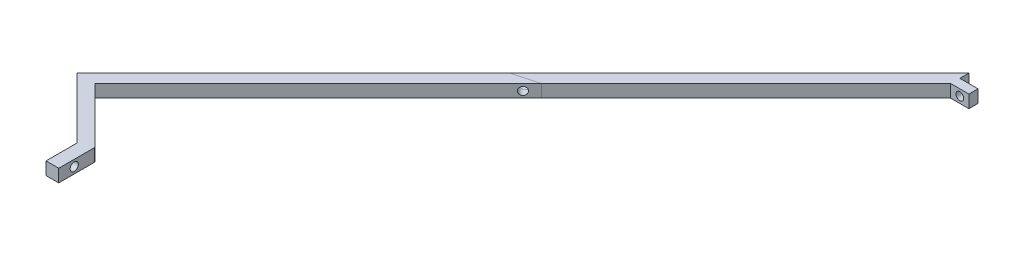
ISO-10303-21;
HEADER;
FILE_DESCRIPTION(('STEP AP214'),'2;1');
FILE_NAME('part.step','',(''),(''),'','','');
FILE_SCHEMA(('AUTOMOTIVE_DESIGN { 1 0 10303 214 1 1 1 1 }'));
ENDSEC;
DATA;
#1=APPLICATION_CONTEXT('core data for automotive mechanical design processes');
#2=APPLICATION_PROTOCOL_DEFINITION('international standard','automotive_design',2000,#1);
#3=PRODUCT_CONTEXT('',#1,'mechanical');
#4=PRODUCT('Part','Part','',(#3));
#5=PRODUCT_RELATED_PRODUCT_CATEGORY('part','',(#4));
#6=PRODUCT_DEFINITION_FORMATION('','',#4);
#7=PRODUCT_DEFINITION_CONTEXT('part definition',#1,'design');
#8=PRODUCT_DEFINITION('design','',#6,#7);
#9=PRODUCT_DEFINITION_SHAPE('','',#8);
#10=(LENGTH_UNIT() NAMED_UNIT(*) SI_UNIT(.MILLI.,.METRE.));
#11=(NAMED_UNIT(*) PLANE_ANGLE_UNIT() SI_UNIT($,.RADIAN.));
#12=(NAMED_UNIT(*) SI_UNIT($,.STERADIAN.) SOLID_ANGLE_UNIT());
#13=UNCERTAINTY_MEASURE_WITH_UNIT(LENGTH_MEASURE(1.E-05),#10,'distance_accuracy_value','');
#14=(GEOMETRIC_REPRESENTATION_CONTEXT(3) GLOBAL_UNCERTAINTY_ASSIGNED_CONTEXT((#13)) GLOBAL_UNIT_ASSIGNED_CONTEXT((#10,
#11,#12)) REPRESENTATION_CONTEXT('',''));
#15=CARTESIAN_POINT('',(0.,0.,0.));
#16=DIRECTION('',(0.,0.,1.));
#17=DIRECTION('',(1.,0.,0.));
#18=AXIS2_PLACEMENT_3D('',#15,#16,#17);
#19=CARTESIAN_POINT('',(-147.271192020746,-0.00999999999999959,110.472946406711));
#20=DIRECTION('',(0.258819045102527,0.,0.965925826289067));
#21=DIRECTION('',(0.965925826289067,0.,-0.258819045102527));
#22=AXIS2_PLACEMENT_3D('',#19,#20,#21);
#23=PLANE('',#22);
#24=CARTESIAN_POINT('',(-141.694416662494,3.5,108.978653953098));
#25=DIRECTION('',(0.258819045102527,0.,0.965925826289067));
#26=DIRECTION('',(-0.965925826289067,0.,0.258819045102527));
#27=AXIS2_PLACEMENT_3D('',#24,#25,#26);
#28=ELLIPSE('',#27,2.4826061575154,2.15000000000001);
#29=CARTESIAN_POINT('',(-144.092430066542,3.5,109.621199708151));
#30=VERTEX_POINT('',#29);
#31=EDGE_CURVE('E192',#30,#30,#28,.F.);
#32=ORIENTED_EDGE('',*,*,#31,.F.);
#33=EDGE_LOOP('',(#32));
#34=FACE_BOUND('',#33,.T.);
#35=DIRECTION('',(0.,-1.,0.));
#36=VECTOR('',#35,1.);
#37=CARTESIAN_POINT('',(-147.271192020746,7.,110.472946406711));
#38=LINE('',#37,#36);
#39=CARTESIAN_POINT('',(-147.271192020746,7.,110.472946406711));
#40=VERTEX_POINT('',#39);
#41=CARTESIAN_POINT('',(-147.271192020746,0.,110.472946406711));
#42=VERTEX_POINT('',#41);
#43=EDGE_CURVE('E260',#40,#42,#38,.T.);
#44=ORIENTED_EDGE('',*,*,#43,.F.);
#45=DIRECTION('',(0.965925826289067,0.,-0.258819045102527));
#46=VECTOR('',#45,1.);
#47=CARTESIAN_POINT('',(17.752937359096,7.,66.2548642077321));
#48=LINE('',#47,#46);
#49=CARTESIAN_POINT('',(-133.610937982901,7.,106.812692368866));
#50=VERTEX_POINT('',#49);
#51=EDGE_CURVE('E105',#40,#50,#48,.T.);
#52=ORIENTED_EDGE('',*,*,#51,.T.);
#53=DIRECTION('',(0.,-1.,0.));
#54=VECTOR('',#53,1.);
#55=CARTESIAN_POINT('',(-133.610937982901,7.,106.812692368866));
#56=LINE('',#55,#54);
#57=CARTESIAN_POINT('',(-133.610937982901,0.,106.812692368866));
#58=VERTEX_POINT('',#57);
#59=EDGE_CURVE('E13',#50,#58,#56,.T.);
#60=ORIENTED_EDGE('',*,*,#59,.T.);
#61=DIRECTION('',(0.965925826289067,0.,-0.258819045102527));
#62=VECTOR('',#61,1.);
#63=CARTESIAN_POINT('',(17.752937359096,0.,66.2548642077321));
#64=LINE('',#63,#62);
#65=EDGE_CURVE('E100',#42,#58,#64,.T.);
#66=ORIENTED_EDGE('',*,*,#65,.F.);
#67=EDGE_LOOP('',(#44,#52,#60,#66));
#68=FACE_BOUND('',#67,.T.);
#69=ADVANCED_FACE('F97',(#34,#68),#23,.F.);
#70=CARTESIAN_POINT('',(-226.113598123046,3.5,271.475778095972));
#71=DIRECTION('',(-1.,0.,0.));
#72=DIRECTION('',(0.,0.,1.));
#73=AXIS2_PLACEMENT_3D('',#70,#71,#72);
#74=CYLINDRICAL_SURFACE('',#73,2.24999999999995);
#75=CARTESIAN_POINT('',(-226.113598123046,3.5,271.475778095972));
#76=DIRECTION('',(-1.,0.,0.));
#77=DIRECTION('',(0.,0.,1.));
#78=AXIS2_PLACEMENT_3D('',#75,#76,#77);
#79=CIRCLE('',#78,2.24999999999995);
#80=CARTESIAN_POINT('',(-226.113598123046,3.5,273.725778095972));
#81=VERTEX_POINT('',#80);
#82=EDGE_CURVE('E220',#81,#81,#79,.T.);
#83=ORIENTED_EDGE('',*,*,#82,.F.);
#84=EDGE_LOOP('',(#83));
#85=FACE_BOUND('',#84,.T.);
#86=CARTESIAN_POINT('',(-233.113598123046,3.5,271.475778095972));
#87=DIRECTION('',(-1.,0.,0.));
#88=DIRECTION('',(0.,0.,1.));
#89=AXIS2_PLACEMENT_3D('',#86,#87,#88);
#90=CIRCLE('',#89,2.24999999999995);
#91=CARTESIAN_POINT('',(-233.113598123046,3.5,273.725778095972));
#92=VERTEX_POINT('',#91);
#93=EDGE_CURVE('E257',#92,#92,#90,.T.);
#94=ORIENTED_EDGE('',*,*,#93,.T.);
#95=EDGE_LOOP('',(#94));
#96=FACE_BOUND('',#95,.T.);
#97=ADVANCED_FACE('F303',(#85,#96),#74,.F.);
#98=CARTESIAN_POINT('',(16.9562162523099,7.,16.9562162523099));
#99=DIRECTION('',(0.707106781186547,0.,0.707106781186547));
#100=DIRECTION('',(0.707106781186548,0.,-0.707106781186548));
#101=AXIS2_PLACEMENT_3D('',#98,#99,#100);
#102=PLANE('',#101);
#103=DIRECTION('',(-0.707106781186548,0.,0.707106781186548));
#104=VECTOR('',#103,1.);
#105=CARTESIAN_POINT('',(16.9562162523099,0.,16.9562162523099));
#106=LINE('',#105,#104);
#107=CARTESIAN_POINT('',(-226.113598123046,0.,260.026030627666));
#108=VERTEX_POINT('',#107);
#109=CARTESIAN_POINT('',(-226.435177530265,0.,260.347610034884));
#110=VERTEX_POINT('',#109);
#111=EDGE_CURVE('E234',#108,#110,#106,.T.);
#112=ORIENTED_EDGE('',*,*,#111,.F.);
#113=DIRECTION('',(0.,-1.,0.));
#114=VECTOR('',#113,1.);
#115=CARTESIAN_POINT('',(-226.113598123046,7.,260.026030627666));
#116=LINE('',#115,#114);
#117=CARTESIAN_POINT('',(-226.113598123046,7.,260.026030627666));
#118=VERTEX_POINT('',#117);
#119=EDGE_CURVE('E243',#118,#108,#116,.T.);
#120=ORIENTED_EDGE('',*,*,#119,.F.);
#121=DIRECTION('',(-0.707106781186548,0.,0.707106781186548));
#122=VECTOR('',#121,1.);
#123=CARTESIAN_POINT('',(16.9562162523099,7.,16.9562162523099));
#124=LINE('',#123,#122);
#125=CARTESIAN_POINT('',(-226.435177530265,7.,260.347610034884));
#126=VERTEX_POINT('',#125);
#127=EDGE_CURVE('E209',#118,#126,#124,.T.);
#128=ORIENTED_EDGE('',*,*,#127,.T.);
#129=DIRECTION('',(0.,-1.,0.));
#130=VECTOR('',#129,1.);
#131=CARTESIAN_POINT('',(-226.435177530265,7.,260.347610034884));
#132=LINE('',#131,#130);
#133=EDGE_CURVE('E245',#126,#110,#132,.T.);
#134=ORIENTED_EDGE('',*,*,#133,.T.);
#135=EDGE_LOOP('',(#112,#120,#128,#134));
#136=FACE_BOUND('',#135,.T.);
#137=ADVANCED_FACE('F283',(#136),#102,.T.);
#138=CARTESIAN_POINT('',(0.,7.,260.347610034884));
#139=DIRECTION('',(0.,0.,1.));
#140=DIRECTION('',(1.,0.,0.));
#141=AXIS2_PLACEMENT_3D('',#138,#139,#140);
#142=PLANE('',#141);
#143=DIRECTION('',(-1.,0.,0.));
#144=VECTOR('',#143,1.);
#145=CARTESIAN_POINT('',(0.,0.,260.347610034884));
#146=LINE('',#145,#144);
#147=CARTESIAN_POINT('',(-226.113598123046,0.,260.347610034884));
#148=VERTEX_POINT('',#147);
#149=EDGE_CURVE('E231',#148,#110,#146,.T.);
#150=ORIENTED_EDGE('',*,*,#149,.T.);
#151=ORIENTED_EDGE('',*,*,#133,.F.);
#152=DIRECTION('',(-1.,0.,0.));
#153=VECTOR('',#152,1.);
#154=CARTESIAN_POINT('',(0.,7.,260.347610034884));
#155=LINE('',#154,#153);
#156=CARTESIAN_POINT('',(-226.113598123046,7.,260.347610034884));
#157=VERTEX_POINT('',#156);
#158=EDGE_CURVE('E207',#157,#126,#155,.T.);
#159=ORIENTED_EDGE('',*,*,#158,.F.);
#160=DIRECTION('',(0.,-1.,0.));
#161=VECTOR('',#160,1.);
#162=CARTESIAN_POINT('',(-226.113598123046,7.,260.347610034884));
#163=LINE('',#162,#161);
#164=EDGE_CURVE('E247',#157,#148,#163,.T.);
#165=ORIENTED_EDGE('',*,*,#164,.T.);
#166=EDGE_LOOP('',(#150,#151,#159,#165));
#167=FACE_BOUND('',#166,.T.);
#168=ADVANCED_FACE('F279',(#167),#142,.F.);
#169=CARTESIAN_POINT('',(-226.113598123046,7.,0.));
#170=DIRECTION('',(1.,0.,0.));
#171=DIRECTION('',(0.,0.,-1.));
#172=AXIS2_PLACEMENT_3D('',#169,#170,#171);
#173=PLANE('',#172);
#174=ORIENTED_EDGE('',*,*,#82,.T.);
#175=EDGE_LOOP('',(#174));
#176=FACE_BOUND('',#175,.T.);
#177=DIRECTION('',(0.,0.,1.));
#178=VECTOR('',#177,1.);
#179=CARTESIAN_POINT('',(-226.113598123046,0.,0.));
#180=LINE('',#179,#178);
#181=CARTESIAN_POINT('',(-226.113598123046,0.,280.026030627666));
#182=VERTEX_POINT('',#181);
#183=EDGE_CURVE('E228',#148,#182,#180,.T.);
#184=ORIENTED_EDGE('',*,*,#183,.F.);
#185=ORIENTED_EDGE('',*,*,#164,.F.);
#186=DIRECTION('',(0.,0.,1.));
#187=VECTOR('',#186,1.);
#188=CARTESIAN_POINT('',(-226.113598123046,7.,0.));
#189=LINE('',#188,#187);
#190=CARTESIAN_POINT('',(-226.113598123046,7.,280.026030627666));
#191=VERTEX_POINT('',#190);
#192=EDGE_CURVE('E204',#157,#191,#189,.T.);
#193=ORIENTED_EDGE('',*,*,#192,.T.);
#194=DIRECTION('',(0.,-1.,0.));
#195=VECTOR('',#194,1.);
#196=CARTESIAN_POINT('',(-226.113598123046,7.,280.026030627666));
#197=LINE('',#196,#195);
#198=EDGE_CURVE('E249',#191,#182,#197,.T.);
#199=ORIENTED_EDGE('',*,*,#198,.T.);
#200=EDGE_LOOP('',(#184,#185,#193,#199));
#201=FACE_BOUND('',#200,.T.);
#202=ADVANCED_FACE('F273',(#176,#201),#173,.T.);
#203=CARTESIAN_POINT('',(0.,7.,280.026030627666));
#204=DIRECTION('',(0.,0.,1.));
#205=DIRECTION('',(1.,0.,0.));
#206=AXIS2_PLACEMENT_3D('',#203,#204,#205);
#207=PLANE('',#206);
#208=DIRECTION('',(-1.,0.,0.));
#209=VECTOR('',#208,1.);
#210=CARTESIAN_POINT('',(0.,0.,280.026030627666));
#211=LINE('',#210,#209);
#212=CARTESIAN_POINT('',(-233.113598123046,0.,280.026030627666));
#213=VERTEX_POINT('',#212);
#214=EDGE_CURVE('E225',#182,#213,#211,.T.);
#215=ORIENTED_EDGE('',*,*,#214,.F.);
#216=ORIENTED_EDGE('',*,*,#198,.F.);
#217=DIRECTION('',(-1.,0.,0.));
#218=VECTOR('',#217,1.);
#219=CARTESIAN_POINT('',(0.,7.,280.026030627666));
#220=LINE('',#219,#218);
#221=CARTESIAN_POINT('',(-233.113598123046,7.,280.026030627666));
#222=VERTEX_POINT('',#221);
#223=EDGE_CURVE('E198',#191,#222,#220,.T.);
#224=ORIENTED_EDGE('',*,*,#223,.T.);
#225=DIRECTION('',(0.,-1.,0.));
#226=VECTOR('',#225,1.);
#227=CARTESIAN_POINT('',(-233.113598123046,7.,280.026030627666));
#228=LINE('',#227,#226);
#229=EDGE_CURVE('E251',#222,#213,#228,.T.);
#230=ORIENTED_EDGE('',*,*,#229,.T.);
#231=EDGE_LOOP('',(#215,#216,#224,#230));
#232=FACE_BOUND('',#231,.T.);
#233=ADVANCED_FACE('F270',(#232),#207,.T.);
#234=CARTESIAN_POINT('',(-233.113598123046,7.,0.));
#235=DIRECTION('',(-1.,0.,0.));
#236=DIRECTION('',(0.,0.,1.));
#237=AXIS2_PLACEMENT_3D('',#234,#235,#236);
#238=PLANE('',#237);
#239=ORIENTED_EDGE('',*,*,#93,.F.);
#240=EDGE_LOOP('',(#239));
#241=FACE_BOUND('',#240,.T.);
#242=DIRECTION('',(0.,0.,-1.));
#243=VECTOR('',#242,1.);
#244=CARTESIAN_POINT('',(-233.113598123046,0.,0.));
#245=LINE('',#244,#243);
#246=CARTESIAN_POINT('',(-233.113598123046,0.,262.925525564278));
#247=VERTEX_POINT('',#246);
#248=EDGE_CURVE('E222',#213,#247,#245,.T.);
#249=ORIENTED_EDGE('',*,*,#248,.F.);
#250=ORIENTED_EDGE('',*,*,#229,.F.);
#251=DIRECTION('',(0.,0.,-1.));
#252=VECTOR('',#251,1.);
#253=CARTESIAN_POINT('',(-233.113598123046,7.,0.));
#254=LINE('',#253,#252);
#255=CARTESIAN_POINT('',(-233.113598123046,7.,262.925525564278));
#256=VERTEX_POINT('',#255);
#257=EDGE_CURVE('E196',#222,#256,#254,.T.);
#258=ORIENTED_EDGE('',*,*,#257,.T.);
#259=DIRECTION('',(0.,-1.,0.));
#260=VECTOR('',#259,1.);
#261=CARTESIAN_POINT('',(-233.113598123046,7.,262.925525564278));
#262=LINE('',#261,#260);
#263=EDGE_CURVE('E193',#256,#247,#262,.T.);
#264=ORIENTED_EDGE('',*,*,#263,.T.);
#265=EDGE_LOOP('',(#249,#250,#258,#264));
#266=FACE_BOUND('',#265,.T.);
#267=ADVANCED_FACE('F266',(#241,#266),#238,.T.);
#268=CARTESIAN_POINT('',(-248.019561843662,7.,248.019561843662));
#269=DIRECTION('',(-0.707106781186547,0.,0.707106781186548));
#270=DIRECTION('',(0.707106781186548,0.,0.707106781186547));
#271=AXIS2_PLACEMENT_3D('',#268,#269,#270);
#272=PLANE('',#271);
#273=DIRECTION('',(-0.707106781186548,0.,-0.707106781186547));
#274=VECTOR('',#273,1.);
#275=CARTESIAN_POINT('',(-248.019561843662,0.,248.019561843662));
#276=LINE('',#275,#274);
#277=CARTESIAN_POINT('',(-266.418684650679,0.,229.620439036644));
#278=VERTEX_POINT('',#277);
#279=EDGE_CURVE('E219',#247,#278,#276,.T.);
#280=ORIENTED_EDGE('',*,*,#279,.F.);
#281=ORIENTED_EDGE('',*,*,#263,.F.);
#282=DIRECTION('',(-0.707106781186548,0.,-0.707106781186547));
#283=VECTOR('',#282,1.);
#284=CARTESIAN_POINT('',(-248.019561843662,7.,248.019561843662));
#285=LINE('',#284,#283);
#286=CARTESIAN_POINT('',(-266.418684650679,7.,229.620439036644));
#287=VERTEX_POINT('',#286);
#288=EDGE_CURVE('E177',#256,#287,#285,.T.);
#289=ORIENTED_EDGE('',*,*,#288,.T.);
#290=DIRECTION('',(0.,-1.,0.));
#291=VECTOR('',#290,1.);
#292=CARTESIAN_POINT('',(-266.418684650679,7.,229.620439036644));
#293=LINE('',#292,#291);
#294=EDGE_CURVE('E186',#287,#278,#293,.T.);
#295=ORIENTED_EDGE('',*,*,#294,.T.);
#296=EDGE_LOOP('',(#280,#281,#289,#295));
#297=FACE_BOUND('',#296,.T.);
#298=ADVANCED_FACE('F195',(#297),#272,.T.);
#299=CARTESIAN_POINT('',(-18.3991228070176,7.,-18.3991228070176));
#300=DIRECTION('',(0.707106781186547,0.,0.707106781186547));
#301=DIRECTION('',(0.707106781186548,0.,-0.707106781186548));
#302=AXIS2_PLACEMENT_3D('',#299,#300,#301);
#303=PLANE('',#302);
#304=DIRECTION('',(-0.707106781186548,0.,0.707106781186548));
#305=VECTOR('',#304,1.);
#306=CARTESIAN_POINT('',(-18.3991228070176,7.,-18.3991228070176));
#307=LINE('',#306,#305);
#308=EDGE_CURVE('E172',#40,#287,#307,.T.);
#309=ORIENTED_EDGE('',*,*,#308,.F.);
#310=ORIENTED_EDGE('',*,*,#43,.T.);
#311=DIRECTION('',(-0.707106781186548,0.,0.707106781186548));
#312=VECTOR('',#311,1.);
#313=CARTESIAN_POINT('',(-18.3991228070176,0.,-18.3991228070176));
#314=LINE('',#313,#312);
#315=EDGE_CURVE('E188',#42,#278,#314,.T.);
#316=ORIENTED_EDGE('',*,*,#315,.T.);
#317=ORIENTED_EDGE('',*,*,#294,.F.);
#318=EDGE_LOOP('',(#309,#310,#316,#317));
#319=FACE_BOUND('',#318,.T.);
#320=ADVANCED_FACE('F187',(#319),#303,.F.);
#321=CARTESIAN_POINT('',(0.,0.,0.));
#322=DIRECTION('',(0.,1.,0.));
#323=DIRECTION('',(0.,0.,1.));
#324=AXIS2_PLACEMENT_3D('',#321,#322,#323);
#325=PLANE('',#324);
#326=ORIENTED_EDGE('',*,*,#315,.F.);
#327=ORIENTED_EDGE('',*,*,#65,.T.);
#328=DIRECTION('',(-0.707106781186546,0.,0.707106781186549));
#329=VECTOR('',#328,1.);
#330=CARTESIAN_POINT('',(-13.3991228070176,0.,-13.3991228070175));
#331=LINE('',#330,#329);
#332=CARTESIAN_POINT('',(-256.468937182373,0.,229.670691568339));
#333=VERTEX_POINT('',#332);
#334=EDGE_CURVE('E183',#58,#333,#331,.T.);
#335=ORIENTED_EDGE('',*,*,#334,.T.);
#336=DIRECTION('',(0.707106781186547,0.,0.707106781186548));
#337=VECTOR('',#336,1.);
#338=CARTESIAN_POINT('',(-243.069814375356,0.,243.069814375356));
#339=LINE('',#338,#337);
#340=EDGE_CURVE('E237',#333,#108,#339,.T.);
#341=ORIENTED_EDGE('',*,*,#340,.T.);
#342=ORIENTED_EDGE('',*,*,#111,.T.);
#343=ORIENTED_EDGE('',*,*,#149,.F.);
#344=ORIENTED_EDGE('',*,*,#183,.T.);
#345=ORIENTED_EDGE('',*,*,#214,.T.);
#346=ORIENTED_EDGE('',*,*,#248,.T.);
#347=ORIENTED_EDGE('',*,*,#279,.T.);
#348=EDGE_LOOP('',(#326,#327,#335,#341,#342,#343,#344,#345,#346,#347));
#349=FACE_BOUND('',#348,.T.);
#350=ADVANCED_FACE('F262',(#349),#325,.F.);
#351=CARTESIAN_POINT('',(-243.069814375356,7.,243.069814375356));
#352=DIRECTION('',(0.707106781186548,0.,-0.707106781186547));
#353=DIRECTION('',(-0.707106781186547,0.,-0.707106781186548));
#354=AXIS2_PLACEMENT_3D('',#351,#352,#353);
#355=PLANE('',#354);
#356=ORIENTED_EDGE('',*,*,#340,.F.);
#357=DIRECTION('',(0.,-1.,0.));
#358=VECTOR('',#357,1.);
#359=CARTESIAN_POINT('',(-256.468937182373,7.,229.670691568339));
#360=LINE('',#359,#358);
#361=CARTESIAN_POINT('',(-256.468937182373,7.,229.670691568339));
#362=VERTEX_POINT('',#361);
#363=EDGE_CURVE('E217',#362,#333,#360,.T.);
#364=ORIENTED_EDGE('',*,*,#363,.F.);
#365=DIRECTION('',(0.707106781186547,0.,0.707106781186548));
#366=VECTOR('',#365,1.);
#367=CARTESIAN_POINT('',(-243.069814375356,7.,243.069814375356));
#368=LINE('',#367,#366);
#369=EDGE_CURVE('E212',#362,#118,#368,.T.);
#370=ORIENTED_EDGE('',*,*,#369,.T.);
#371=ORIENTED_EDGE('',*,*,#119,.T.);
#372=EDGE_LOOP('',(#356,#364,#370,#371));
#373=FACE_BOUND('',#372,.T.);
#374=ADVANCED_FACE('F286',(#373),#355,.T.);
#375=CARTESIAN_POINT('',(0.,7.,0.));
#376=DIRECTION('',(0.,1.,0.));
#377=DIRECTION('',(0.,0.,1.));
#378=AXIS2_PLACEMENT_3D('',#375,#376,#377);
#379=PLANE('',#378);
#380=ORIENTED_EDGE('',*,*,#51,.F.);
#381=ORIENTED_EDGE('',*,*,#308,.T.);
#382=ORIENTED_EDGE('',*,*,#288,.F.);
#383=ORIENTED_EDGE('',*,*,#257,.F.);
#384=ORIENTED_EDGE('',*,*,#223,.F.);
#385=ORIENTED_EDGE('',*,*,#192,.F.);
#386=ORIENTED_EDGE('',*,*,#158,.T.);
#387=ORIENTED_EDGE('',*,*,#127,.F.);
#388=ORIENTED_EDGE('',*,*,#369,.F.);
#389=DIRECTION('',(-0.707106781186546,0.,0.707106781186549));
#390=VECTOR('',#389,1.);
#391=CARTESIAN_POINT('',(-13.3991228070176,7.,-13.3991228070175));
#392=LINE('',#391,#390);
#393=EDGE_CURVE('E215',#50,#362,#392,.T.);
#394=ORIENTED_EDGE('',*,*,#393,.F.);
#395=EDGE_LOOP('',(#380,#381,#382,#383,#384,#385,#386,#387,#388,#394));
#396=FACE_BOUND('',#395,.T.);
#397=ADVANCED_FACE('F174',(#396),#379,.T.);
#398=CARTESIAN_POINT('',(-13.3991228070176,7.,-13.3991228070175));
#399=DIRECTION('',(0.707106781186549,0.,0.707106781186546));
#400=DIRECTION('',(0.707106781186546,0.,-0.707106781186549));
#401=AXIS2_PLACEMENT_3D('',#398,#399,#400);
#402=PLANE('',#401);
#403=ORIENTED_EDGE('',*,*,#59,.F.);
#404=ORIENTED_EDGE('',*,*,#393,.T.);
#405=ORIENTED_EDGE('',*,*,#363,.T.);
#406=ORIENTED_EDGE('',*,*,#334,.F.);
#407=EDGE_LOOP('',(#403,#404,#405,#406));
#408=FACE_BOUND('',#407,.T.);
#409=CARTESIAN_POINT('',(-138.735658114813,3.5,111.937412500778));
#410=DIRECTION('',(0.707106781186549,0.,0.707106781186546));
#411=DIRECTION('',(0.707106781186546,0.,-0.707106781186549));
#412=AXIS2_PLACEMENT_3D('',#409,#410,#411);
#413=CIRCLE('',#412,2.15000000000001);
#414=CARTESIAN_POINT('',(-137.215378535262,3.5,110.417132921227));
#415=VERTEX_POINT('',#414);
#416=EDGE_CURVE('E254',#415,#415,#413,.T.);
#417=ORIENTED_EDGE('',*,*,#416,.F.);
#418=EDGE_LOOP('',(#417));
#419=FACE_BOUND('',#418,.T.);
#420=ADVANCED_FACE('F288',(#408,#419),#402,.T.);
#421=CARTESIAN_POINT('',(-136.664590302948,3.5,114.008480312644));
#422=DIRECTION('',(-0.707106781186548,0.,-0.707106781186547));
#423=DIRECTION('',(-0.707106781186547,0.,0.707106781186548));
#424=AXIS2_PLACEMENT_3D('',#421,#422,#423);
#425=CYLINDRICAL_SURFACE('',#424,2.15000000000001);
#426=ORIENTED_EDGE('',*,*,#31,.T.);
#427=EDGE_LOOP('',(#426));
#428=FACE_BOUND('',#427,.T.);
#429=ORIENTED_EDGE('',*,*,#416,.T.);
#430=EDGE_LOOP('',(#429));
#431=FACE_BOUND('',#430,.T.);
#432=ADVANCED_FACE('F291',(#428,#431),#425,.F.);
#433=CLOSED_SHELL('',(#69,#97,#137,#168,#202,#233,#267,#298,#320,#350,#374,#397,#420,#432));
#434=MANIFOLD_SOLID_BREP('B2',#433);
#435=CARTESIAN_POINT('',(-147.271192020746,-0.00999999999999959,110.472946406711));
#436=DIRECTION('',(0.258819045102527,0.,0.965925826289067));
#437=DIRECTION('',(0.965925826289067,0.,-0.258819045102527));
#438=AXIS2_PLACEMENT_3D('',#435,#436,#437);
#439=PLANE('',#438);
#440=DIRECTION('',(0.,-1.,0.));
#441=VECTOR('',#440,1.);
#442=CARTESIAN_POINT('',(-147.271192020746,7.,110.472946406711));
#443=LINE('',#442,#441);
#444=CARTESIAN_POINT('',(-147.271192020746,7.,110.472946406711));
#445=VERTEX_POINT('',#444);
#446=CARTESIAN_POINT('',(-147.271192020746,0.,110.472946406711));
#447=VERTEX_POINT('',#446);
#448=EDGE_CURVE('E528',#445,#447,#443,.T.);
#449=ORIENTED_EDGE('',*,*,#448,.T.);
#450=DIRECTION('',(0.965925826289067,0.,-0.258819045102527));
#451=VECTOR('',#450,1.);
#452=CARTESIAN_POINT('',(17.752937359096,0.,66.2548642077321));
#453=LINE('',#452,#451);
#454=CARTESIAN_POINT('',(-133.610937982901,0.,106.812692368866));
#455=VERTEX_POINT('',#454);
#456=EDGE_CURVE('E553',#447,#455,#453,.T.);
#457=ORIENTED_EDGE('',*,*,#456,.T.);
#458=DIRECTION('',(0.,-1.,0.));
#459=VECTOR('',#458,1.);
#460=CARTESIAN_POINT('',(-133.610937982901,7.,106.812692368866));
#461=LINE('',#460,#459);
#462=CARTESIAN_POINT('',(-133.610937982901,7.,106.812692368866));
#463=VERTEX_POINT('',#462);
#464=EDGE_CURVE('E547',#463,#455,#461,.T.);
#465=ORIENTED_EDGE('',*,*,#464,.F.);
#466=DIRECTION('',(0.965925826289067,0.,-0.258819045102527));
#467=VECTOR('',#466,1.);
#468=CARTESIAN_POINT('',(17.752937359096,7.,66.2548642077321));
#469=LINE('',#468,#467);
#470=EDGE_CURVE('E550',#445,#463,#469,.T.);
#471=ORIENTED_EDGE('',*,*,#470,.F.);
#472=EDGE_LOOP('',(#449,#457,#465,#471));
#473=FACE_BOUND('',#472,.T.);
#474=CARTESIAN_POINT('',(-141.694416662494,3.5,108.978653953098));
#475=DIRECTION('',(0.258819045102527,0.,0.965925826289067));
#476=DIRECTION('',(-0.965925826289067,0.,0.258819045102527));
#477=AXIS2_PLACEMENT_3D('',#474,#475,#476);
#478=ELLIPSE('',#477,2.4826061575154,2.15000000000001);
#479=CARTESIAN_POINT('',(-144.092430066542,3.5,109.621199708151));
#480=VERTEX_POINT('',#479);
#481=EDGE_CURVE('E556',#480,#480,#478,.F.);
#482=ORIENTED_EDGE('',*,*,#481,.T.);
#483=EDGE_LOOP('',(#482));
#484=FACE_BOUND('',#483,.T.);
#485=ADVANCED_FACE('F456',(#473,#484),#439,.T.);
#486=CARTESIAN_POINT('',(-18.3991228070176,7.,-18.3991228070176));
#487=DIRECTION('',(0.707106781186547,0.,0.707106781186547));
#488=DIRECTION('',(0.707106781186548,0.,-0.707106781186548));
#489=AXIS2_PLACEMENT_3D('',#486,#487,#488);
#490=PLANE('',#489);
#491=CARTESIAN_POINT('',(-143.735658114813,3.5,106.937412500778));
#492=DIRECTION('',(-0.707106781186548,0.,-0.707106781186547));
#493=DIRECTION('',(-0.707106781186547,0.,0.707106781186548));
#494=AXIS2_PLACEMENT_3D('',#491,#492,#493);
#495=CIRCLE('',#494,2.15000000000001);
#496=CARTESIAN_POINT('',(-145.255937694364,3.5,108.457692080329));
#497=VERTEX_POINT('',#496);
#498=EDGE_CURVE('E95',#497,#497,#495,.T.);
#499=ORIENTED_EDGE('',*,*,#498,.F.);
#500=EDGE_LOOP('',(#499));
#501=FACE_BOUND('',#500,.T.);
#502=ORIENTED_EDGE('',*,*,#448,.F.);
#503=DIRECTION('',(-0.707106781186548,0.,0.707106781186548));
#504=VECTOR('',#503,1.);
#505=CARTESIAN_POINT('',(-18.3991228070176,7.,-18.3991228070176));
#506=LINE('',#505,#504);
#507=CARTESIAN_POINT('',(-21.0526315789474,7.,-15.7456140350877));
#508=VERTEX_POINT('',#507);
#509=EDGE_CURVE('E524',#508,#445,#506,.T.);
#510=ORIENTED_EDGE('',*,*,#509,.F.);
#511=DIRECTION('',(0.,-1.,0.));
#512=VECTOR('',#511,1.);
#513=CARTESIAN_POINT('',(-21.0526315789474,7.,-15.7456140350877));
#514=LINE('',#513,#512);
#515=CARTESIAN_POINT('',(-21.0526315789474,0.,-15.7456140350877));
#516=VERTEX_POINT('',#515);
#517=EDGE_CURVE('E510',#508,#516,#514,.T.);
#518=ORIENTED_EDGE('',*,*,#517,.T.);
#519=DIRECTION('',(-0.707106781186548,0.,0.707106781186548));
#520=VECTOR('',#519,1.);
#521=CARTESIAN_POINT('',(-18.3991228070176,0.,-18.3991228070176));
#522=LINE('',#521,#520);
#523=EDGE_CURVE('E460',#516,#447,#522,.T.);
#524=ORIENTED_EDGE('',*,*,#523,.T.);
#525=EDGE_LOOP('',(#502,#510,#518,#524));
#526=FACE_BOUND('',#525,.T.);
#527=ADVANCED_FACE('F525',(#501,#526),#490,.F.);
#528=CARTESIAN_POINT('',(0.,0.,0.));
#529=DIRECTION('',(0.,1.,0.));
#530=DIRECTION('',(0.,0.,1.));
#531=AXIS2_PLACEMENT_3D('',#528,#529,#530);
#532=PLANE('',#531);
#533=ORIENTED_EDGE('',*,*,#456,.F.);
#534=ORIENTED_EDGE('',*,*,#523,.F.);
#535=DIRECTION('',(0.,0.,1.));
#536=VECTOR('',#535,1.);
#537=CARTESIAN_POINT('',(-21.0526315789474,0.,0.));
#538=LINE('',#537,#536);
#539=CARTESIAN_POINT('',(-21.0526315789474,0.,-10.7456140350877));
#540=VERTEX_POINT('',#539);
#541=EDGE_CURVE('E516',#516,#540,#538,.T.);
#542=ORIENTED_EDGE('',*,*,#541,.T.);
#543=DIRECTION('',(1.,0.,0.));
#544=VECTOR('',#543,1.);
#545=CARTESIAN_POINT('',(-21.0526315789474,0.,-10.7456140350877));
#546=LINE('',#545,#544);
#547=CARTESIAN_POINT('',(-11.0526315789474,0.,-10.7456140350877));
#548=VERTEX_POINT('',#547);
#549=EDGE_CURVE('E566',#540,#548,#546,.T.);
#550=ORIENTED_EDGE('',*,*,#549,.T.);
#551=DIRECTION('',(0.,0.,1.));
#552=VECTOR('',#551,1.);
#553=CARTESIAN_POINT('',(-11.0526315789474,0.,-10.7456140350877));
#554=LINE('',#553,#552);
#555=CARTESIAN_POINT('',(-11.0526315789474,0.,-5.74561403508773));
#556=VERTEX_POINT('',#555);
#557=EDGE_CURVE('E570',#548,#556,#554,.T.);
#558=ORIENTED_EDGE('',*,*,#557,.T.);
#559=DIRECTION('',(1.,0.,0.));
#560=VECTOR('',#559,1.);
#561=CARTESIAN_POINT('',(-21.0526315789474,0.,-5.74561403508773));
#562=LINE('',#561,#560);
#563=CARTESIAN_POINT('',(-21.0526315789474,0.,-5.74561403508771));
#564=VERTEX_POINT('',#563);
#565=EDGE_CURVE('E573',#564,#556,#562,.T.);
#566=ORIENTED_EDGE('',*,*,#565,.F.);
#567=DIRECTION('',(-0.707106781186546,0.,0.707106781186549));
#568=VECTOR('',#567,1.);
#569=CARTESIAN_POINT('',(-13.3991228070176,0.,-13.3991228070175));
#570=LINE('',#569,#568);
#571=EDGE_CURVE('E538',#564,#455,#570,.T.);
#572=ORIENTED_EDGE('',*,*,#571,.T.);
#573=EDGE_LOOP('',(#533,#534,#542,#550,#558,#566,#572));
#574=FACE_BOUND('',#573,.T.);
#575=ADVANCED_FACE('F601',(#574),#532,.F.);
#576=CARTESIAN_POINT('',(0.,7.,0.));
#577=DIRECTION('',(0.,1.,0.));
#578=DIRECTION('',(0.,0.,1.));
#579=AXIS2_PLACEMENT_3D('',#576,#577,#578);
#580=PLANE('',#579);
#581=ORIENTED_EDGE('',*,*,#509,.T.);
#582=ORIENTED_EDGE('',*,*,#470,.T.);
#583=DIRECTION('',(-0.707106781186546,0.,0.707106781186549));
#584=VECTOR('',#583,1.);
#585=CARTESIAN_POINT('',(-13.3991228070176,7.,-13.3991228070175));
#586=LINE('',#585,#584);
#587=CARTESIAN_POINT('',(-21.0526315789474,7.,-5.74561403508771));
#588=VERTEX_POINT('',#587);
#589=EDGE_CURVE('E531',#588,#463,#586,.T.);
#590=ORIENTED_EDGE('',*,*,#589,.F.);
#591=DIRECTION('',(1.,0.,0.));
#592=VECTOR('',#591,1.);
#593=CARTESIAN_POINT('',(-21.0526315789474,7.,-5.74561403508773));
#594=LINE('',#593,#592);
#595=CARTESIAN_POINT('',(-11.0526315789474,7.,-5.74561403508773));
#596=VERTEX_POINT('',#595);
#597=EDGE_CURVE('E567',#588,#596,#594,.T.);
#598=ORIENTED_EDGE('',*,*,#597,.T.);
#599=DIRECTION('',(0.,0.,1.));
#600=VECTOR('',#599,1.);
#601=CARTESIAN_POINT('',(-11.0526315789474,7.,-10.7456140350877));
#602=LINE('',#601,#600);
#603=CARTESIAN_POINT('',(-11.0526315789474,7.,-10.7456140350877));
#604=VERTEX_POINT('',#603);
#605=EDGE_CURVE('E564',#604,#596,#602,.T.);
#606=ORIENTED_EDGE('',*,*,#605,.F.);
#607=DIRECTION('',(1.,0.,0.));
#608=VECTOR('',#607,1.);
#609=CARTESIAN_POINT('',(-21.0526315789474,7.,-10.7456140350877));
#610=LINE('',#609,#608);
#611=CARTESIAN_POINT('',(-21.0526315789474,7.,-10.7456140350877));
#612=VERTEX_POINT('',#611);
#613=EDGE_CURVE('E537',#612,#604,#610,.T.);
#614=ORIENTED_EDGE('',*,*,#613,.F.);
#615=DIRECTION('',(0.,0.,1.));
#616=VECTOR('',#615,1.);
#617=CARTESIAN_POINT('',(-21.0526315789474,7.,0.));
#618=LINE('',#617,#616);
#619=EDGE_CURVE('E514',#508,#612,#618,.T.);
#620=ORIENTED_EDGE('',*,*,#619,.F.);
#621=EDGE_LOOP('',(#581,#582,#590,#598,#606,#614,#620));
#622=FACE_BOUND('',#621,.T.);
#623=ADVANCED_FACE('F534',(#622),#580,.T.);
#624=CARTESIAN_POINT('',(-13.3991228070176,7.,-13.3991228070175));
#625=DIRECTION('',(0.707106781186549,0.,0.707106781186546));
#626=DIRECTION('',(0.707106781186546,0.,-0.707106781186549));
#627=AXIS2_PLACEMENT_3D('',#624,#625,#626);
#628=PLANE('',#627);
#629=ORIENTED_EDGE('',*,*,#589,.T.);
#630=ORIENTED_EDGE('',*,*,#464,.T.);
#631=ORIENTED_EDGE('',*,*,#571,.F.);
#632=DIRECTION('',(0.,-1.,0.));
#633=VECTOR('',#632,1.);
#634=CARTESIAN_POINT('',(-21.0526315789474,7.,-5.74561403508771));
#635=LINE('',#634,#633);
#636=EDGE_CURVE('E504',#588,#564,#635,.T.);
#637=ORIENTED_EDGE('',*,*,#636,.F.);
#638=EDGE_LOOP('',(#629,#630,#631,#637));
#639=FACE_BOUND('',#638,.T.);
#640=ADVANCED_FACE('F613',(#639),#628,.T.);
#641=CARTESIAN_POINT('',(-136.664590302948,3.5,114.008480312644));
#642=DIRECTION('',(-0.707106781186548,0.,-0.707106781186547));
#643=DIRECTION('',(-0.707106781186547,0.,0.707106781186548));
#644=AXIS2_PLACEMENT_3D('',#641,#642,#643);
#645=CYLINDRICAL_SURFACE('',#644,2.15000000000001);
#646=ORIENTED_EDGE('',*,*,#498,.T.);
#647=EDGE_LOOP('',(#646));
#648=FACE_BOUND('',#647,.T.);
#649=ORIENTED_EDGE('',*,*,#481,.F.);
#650=EDGE_LOOP('',(#649));
#651=FACE_BOUND('',#650,.T.);
#652=ADVANCED_FACE('F458',(#648,#651),#645,.F.);
#653=CARTESIAN_POINT('',(-21.0526315789474,7.,0.));
#654=DIRECTION('',(1.,0.,0.));
#655=DIRECTION('',(0.,0.,-1.));
#656=AXIS2_PLACEMENT_3D('',#653,#654,#655);
#657=PLANE('',#656);
#658=ORIENTED_EDGE('',*,*,#619,.T.);
#659=DIRECTION('',(0.,-1.,0.));
#660=VECTOR('',#659,1.);
#661=CARTESIAN_POINT('',(-21.0526315789474,7.,-10.7456140350877));
#662=LINE('',#661,#660);
#663=EDGE_CURVE('E520',#612,#540,#662,.T.);
#664=ORIENTED_EDGE('',*,*,#663,.T.);
#665=ORIENTED_EDGE('',*,*,#541,.F.);
#666=ORIENTED_EDGE('',*,*,#517,.F.);
#667=EDGE_LOOP('',(#658,#664,#665,#666));
#668=FACE_BOUND('',#667,.T.);
#669=ADVANCED_FACE('F512',(#668),#657,.T.);
#670=CARTESIAN_POINT('',(-11.0526315789474,7.,-10.7456140350877));
#671=DIRECTION('',(1.,0.,0.));
#672=DIRECTION('',(0.,0.,-1.));
#673=AXIS2_PLACEMENT_3D('',#670,#671,#672);
#674=PLANE('',#673);
#675=ORIENTED_EDGE('',*,*,#557,.F.);
#676=DIRECTION('',(0.,-1.,0.));
#677=VECTOR('',#676,1.);
#678=CARTESIAN_POINT('',(-11.0526315789474,7.,-10.7456140350877));
#679=LINE('',#678,#677);
#680=EDGE_CURVE('E577',#604,#548,#679,.T.);
#681=ORIENTED_EDGE('',*,*,#680,.F.);
#682=ORIENTED_EDGE('',*,*,#605,.T.);
#683=DIRECTION('',(0.,-1.,0.));
#684=VECTOR('',#683,1.);
#685=CARTESIAN_POINT('',(-11.0526315789474,7.,-5.74561403508773));
#686=LINE('',#685,#684);
#687=EDGE_CURVE('E475',#596,#556,#686,.T.);
#688=ORIENTED_EDGE('',*,*,#687,.T.);
#689=EDGE_LOOP('',(#675,#681,#682,#688));
#690=FACE_BOUND('',#689,.T.);
#691=ADVANCED_FACE('F623',(#690),#674,.T.);
#692=CARTESIAN_POINT('',(-21.0526315789474,7.,-10.7456140350877));
#693=DIRECTION('',(0.,0.,-1.));
#694=DIRECTION('',(-1.,0.,0.));
#695=AXIS2_PLACEMENT_3D('',#692,#693,#694);
#696=PLANE('',#695);
#697=CARTESIAN_POINT('',(-16.0526315789474,3.5,-10.7456140350877));
#698=DIRECTION('',(0.,0.,-1.));
#699=DIRECTION('',(-1.,0.,0.));
#700=AXIS2_PLACEMENT_3D('',#697,#698,#699);
#701=CIRCLE('',#700,2.15);
#702=CARTESIAN_POINT('',(-18.2026315789474,3.5,-10.7456140350877));
#703=VERTEX_POINT('',#702);
#704=EDGE_CURVE('E466',#703,#703,#701,.T.);
#705=ORIENTED_EDGE('',*,*,#704,.F.);
#706=EDGE_LOOP('',(#705));
#707=FACE_BOUND('',#706,.T.);
#708=ORIENTED_EDGE('',*,*,#549,.F.);
#709=ORIENTED_EDGE('',*,*,#663,.F.);
#710=ORIENTED_EDGE('',*,*,#613,.T.);
#711=ORIENTED_EDGE('',*,*,#680,.T.);
#712=EDGE_LOOP('',(#708,#709,#710,#711));
#713=FACE_BOUND('',#712,.T.);
#714=ADVANCED_FACE('F594',(#707,#713),#696,.T.);
#715=CARTESIAN_POINT('',(-21.0526315789474,7.,-5.74561403508773));
#716=DIRECTION('',(0.,0.,-1.));
#717=DIRECTION('',(-1.,0.,0.));
#718=AXIS2_PLACEMENT_3D('',#715,#716,#717);
#719=PLANE('',#718);
#720=CARTESIAN_POINT('',(-16.0526315789474,3.5,-5.74561403508773));
#721=DIRECTION('',(0.,0.,-1.));
#722=DIRECTION('',(-1.,0.,0.));
#723=AXIS2_PLACEMENT_3D('',#720,#721,#722);
#724=CIRCLE('',#723,2.15);
#725=CARTESIAN_POINT('',(-18.2026315789474,3.5,-5.74561403508773));
#726=VERTEX_POINT('',#725);
#727=EDGE_CURVE('E545',#726,#726,#724,.T.);
#728=ORIENTED_EDGE('',*,*,#727,.T.);
#729=EDGE_LOOP('',(#728));
#730=FACE_BOUND('',#729,.T.);
#731=ORIENTED_EDGE('',*,*,#565,.T.);
#732=ORIENTED_EDGE('',*,*,#687,.F.);
#733=ORIENTED_EDGE('',*,*,#597,.F.);
#734=ORIENTED_EDGE('',*,*,#636,.T.);
#735=EDGE_LOOP('',(#731,#732,#733,#734));
#736=FACE_BOUND('',#735,.T.);
#737=ADVANCED_FACE('F584',(#730,#736),#719,.F.);
#738=CARTESIAN_POINT('',(-16.0526315789474,3.5,-3.74561403508773));
#739=DIRECTION('',(0.,0.,-1.));
#740=DIRECTION('',(-1.,0.,0.));
#741=AXIS2_PLACEMENT_3D('',#738,#739,#740);
#742=CYLINDRICAL_SURFACE('',#741,2.15);
#743=ORIENTED_EDGE('',*,*,#704,.T.);
#744=EDGE_LOOP('',(#743));
#745=FACE_BOUND('',#744,.T.);
#746=ORIENTED_EDGE('',*,*,#727,.F.);
#747=EDGE_LOOP('',(#746));
#748=FACE_BOUND('',#747,.T.);
#749=ADVANCED_FACE('F586',(#745,#748),#742,.F.);
#750=CLOSED_SHELL('',(#485,#527,#575,#623,#640,#652,#669,#691,#714,#737,#749));
#751=MANIFOLD_SOLID_BREP('B7',#750);
#752=ADVANCED_BREP_SHAPE_REPRESENTATION('',(#18,#434,#751),#14);
#753=SHAPE_DEFINITION_REPRESENTATION(#9,#752);
ENDSEC;
END-ISO-10303-21;
